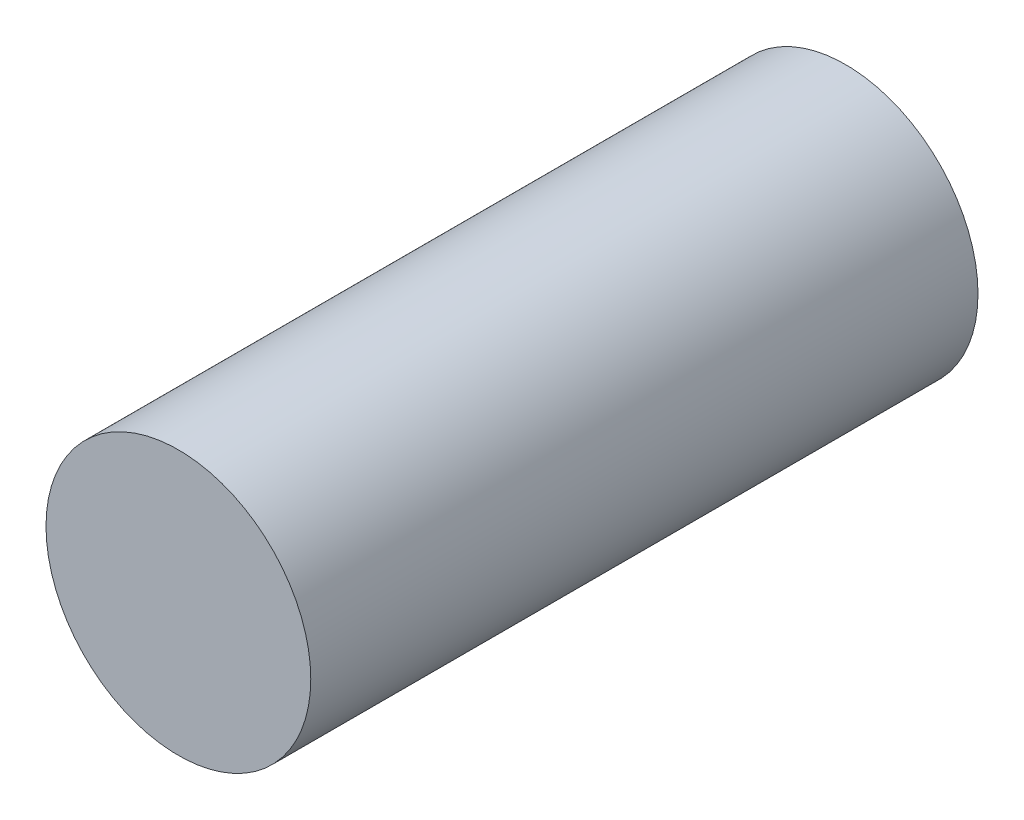
ISO-10303-21;
HEADER;
FILE_DESCRIPTION(('STEP AP214'),'2;1');
FILE_NAME('part.step','',(''),(''),'','','');
FILE_SCHEMA(('AUTOMOTIVE_DESIGN { 1 0 10303 214 1 1 1 1 }'));
ENDSEC;
DATA;
#1=APPLICATION_CONTEXT('core data for automotive mechanical design processes');
#2=APPLICATION_PROTOCOL_DEFINITION('international standard','automotive_design',2000,#1);
#3=PRODUCT_CONTEXT('',#1,'mechanical');
#4=PRODUCT('Part','Part','',(#3));
#5=PRODUCT_RELATED_PRODUCT_CATEGORY('part','',(#4));
#6=PRODUCT_DEFINITION_FORMATION('','',#4);
#7=PRODUCT_DEFINITION_CONTEXT('part definition',#1,'design');
#8=PRODUCT_DEFINITION('design','',#6,#7);
#9=PRODUCT_DEFINITION_SHAPE('','',#8);
#10=(LENGTH_UNIT() NAMED_UNIT(*) SI_UNIT(.MILLI.,.METRE.));
#11=(NAMED_UNIT(*) PLANE_ANGLE_UNIT() SI_UNIT($,.RADIAN.));
#12=(NAMED_UNIT(*) SI_UNIT($,.STERADIAN.) SOLID_ANGLE_UNIT());
#13=UNCERTAINTY_MEASURE_WITH_UNIT(LENGTH_MEASURE(1.E-05),#10,'distance_accuracy_value','');
#14=(GEOMETRIC_REPRESENTATION_CONTEXT(3) GLOBAL_UNCERTAINTY_ASSIGNED_CONTEXT((#13)) GLOBAL_UNIT_ASSIGNED_CONTEXT((#10,
#11,#12)) REPRESENTATION_CONTEXT('',''));
#15=CARTESIAN_POINT('',(0.,0.,0.));
#16=DIRECTION('',(0.,0.,1.));
#17=DIRECTION('',(1.,0.,0.));
#18=AXIS2_PLACEMENT_3D('',#15,#16,#17);
#19=CARTESIAN_POINT('',(5.43566330823478,11.9602100238709,1.26));
#20=DIRECTION('',(0.,0.,-1.));
#21=DIRECTION('',(-1.,0.,0.));
#22=AXIS2_PLACEMENT_3D('',#19,#20,#21);
#23=CYLINDRICAL_SURFACE('',#22,0.250000000000015);
#24=CARTESIAN_POINT('',(5.43566330823478,11.9602100238709,1.26));
#25=DIRECTION('',(0.,0.,1.));
#26=DIRECTION('',(1.,0.,0.));
#27=AXIS2_PLACEMENT_3D('',#24,#25,#26);
#28=CIRCLE('',#27,0.250000000000015);
#29=CARTESIAN_POINT('',(5.68566330823479,11.9602100238709,1.26));
#30=VERTEX_POINT('',#29);
#31=EDGE_CURVE('E10',#30,#30,#28,.T.);
#32=ORIENTED_EDGE('',*,*,#31,.F.);
#33=EDGE_LOOP('',(#32));
#34=FACE_BOUND('',#33,.T.);
#35=CARTESIAN_POINT('',(5.43566330823478,11.9602100238709,0.));
#36=DIRECTION('',(0.,0.,1.));
#37=DIRECTION('',(1.,0.,0.));
#38=AXIS2_PLACEMENT_3D('',#35,#36,#37);
#39=CIRCLE('',#38,0.250000000000015);
#40=CARTESIAN_POINT('',(5.68566330823479,11.9602100238709,0.));
#41=VERTEX_POINT('',#40);
#42=EDGE_CURVE('E36',#41,#41,#39,.T.);
#43=ORIENTED_EDGE('',*,*,#42,.T.);
#44=EDGE_LOOP('',(#43));
#45=FACE_BOUND('',#44,.T.);
#46=ADVANCED_FACE('F33',(#34,#45),#23,.T.);
#47=CARTESIAN_POINT('',(5.43566330823478,11.9602100238709,1.26));
#48=DIRECTION('',(0.,0.,1.));
#49=DIRECTION('',(1.,0.,0.));
#50=AXIS2_PLACEMENT_3D('',#47,#48,#49);
#51=PLANE('',#50);
#52=ORIENTED_EDGE('',*,*,#31,.T.);
#53=EDGE_LOOP('',(#52));
#54=FACE_BOUND('',#53,.T.);
#55=ADVANCED_FACE('F48',(#54),#51,.T.);
#56=CARTESIAN_POINT('',(5.43566330823478,11.9602100238709,0.));
#57=DIRECTION('',(0.,0.,1.));
#58=DIRECTION('',(1.,0.,0.));
#59=AXIS2_PLACEMENT_3D('',#56,#57,#58);
#60=PLANE('',#59);
#61=ORIENTED_EDGE('',*,*,#42,.F.);
#62=EDGE_LOOP('',(#61));
#63=FACE_BOUND('',#62,.T.);
#64=ADVANCED_FACE('F46',(#63),#60,.F.);
#65=CLOSED_SHELL('',(#46,#55,#64));
#66=MANIFOLD_SOLID_BREP('B2',#65);
#67=ADVANCED_BREP_SHAPE_REPRESENTATION('',(#18,#66),#14);
#68=SHAPE_DEFINITION_REPRESENTATION(#9,#67);
ENDSEC;
END-ISO-10303-21;
